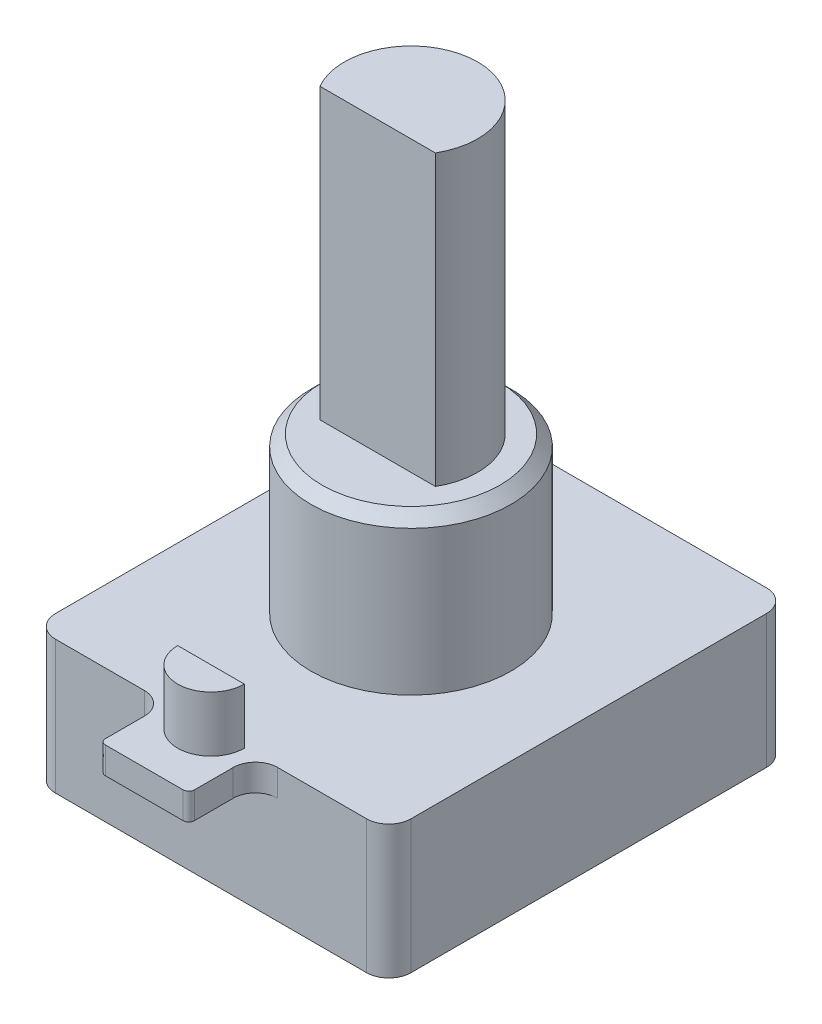
ISO-10303-21;
HEADER;
FILE_DESCRIPTION(('STEP AP214'),'2;1');
FILE_NAME('part.step','',(''),(''),'','','');
FILE_SCHEMA(('AUTOMOTIVE_DESIGN { 1 0 10303 214 1 1 1 1 }'));
ENDSEC;
DATA;
#1=APPLICATION_CONTEXT('core data for automotive mechanical design processes');
#2=APPLICATION_PROTOCOL_DEFINITION('international standard','automotive_design',2000,#1);
#3=PRODUCT_CONTEXT('',#1,'mechanical');
#4=PRODUCT('Part','Part','',(#3));
#5=PRODUCT_RELATED_PRODUCT_CATEGORY('part','',(#4));
#6=PRODUCT_DEFINITION_FORMATION('','',#4);
#7=PRODUCT_DEFINITION_CONTEXT('part definition',#1,'design');
#8=PRODUCT_DEFINITION('design','',#6,#7);
#9=PRODUCT_DEFINITION_SHAPE('','',#8);
#10=(LENGTH_UNIT() NAMED_UNIT(*) SI_UNIT(.MILLI.,.METRE.));
#11=(NAMED_UNIT(*) PLANE_ANGLE_UNIT() SI_UNIT($,.RADIAN.));
#12=(NAMED_UNIT(*) SI_UNIT($,.STERADIAN.) SOLID_ANGLE_UNIT());
#13=UNCERTAINTY_MEASURE_WITH_UNIT(LENGTH_MEASURE(1.E-05),#10,'distance_accuracy_value','');
#14=(GEOMETRIC_REPRESENTATION_CONTEXT(3) GLOBAL_UNCERTAINTY_ASSIGNED_CONTEXT((#13)) GLOBAL_UNIT_ASSIGNED_CONTEXT((#10,
#11,#12)) REPRESENTATION_CONTEXT('',''));
#15=CARTESIAN_POINT('',(0.,0.,0.));
#16=DIRECTION('',(0.,0.,1.));
#17=DIRECTION('',(1.,0.,0.));
#18=AXIS2_PLACEMENT_3D('',#15,#16,#17);
#19=CARTESIAN_POINT('',(0.,6.,0.));
#20=DIRECTION('',(0.,-1.,0.));
#21=DIRECTION('',(0.,0.,-1.));
#22=AXIS2_PLACEMENT_3D('',#19,#20,#21);
#23=PLANE('',#22);
#24=DIRECTION('',(-1.,0.,0.));
#25=VECTOR('',#24,1.);
#26=CARTESIAN_POINT('',(-2.,6.,12.));
#27=LINE('',#26,#25);
#28=CARTESIAN_POINT('',(1.75,6.,12.));
#29=VERTEX_POINT('',#28);
#30=CARTESIAN_POINT('',(-1.75,6.,12.));
#31=VERTEX_POINT('',#30);
#32=EDGE_CURVE('E214',#29,#31,#27,.T.);
#33=ORIENTED_EDGE('',*,*,#32,.F.);
#34=CARTESIAN_POINT('',(1.75,6.,11.75));
#35=DIRECTION('',(0.,-1.,0.));
#36=DIRECTION('',(0.,0.,-1.));
#37=AXIS2_PLACEMENT_3D('',#34,#35,#36);
#38=CIRCLE('',#37,0.25);
#39=CARTESIAN_POINT('',(2.,6.,11.75));
#40=VERTEX_POINT('',#39);
#41=EDGE_CURVE('E321',#29,#40,#38,.F.);
#42=ORIENTED_EDGE('',*,*,#41,.T.);
#43=DIRECTION('',(0.,0.,-1.));
#44=VECTOR('',#43,1.);
#45=CARTESIAN_POINT('',(2.,6.,12.));
#46=LINE('',#45,#44);
#47=CARTESIAN_POINT('',(2.,6.,10.));
#48=VERTEX_POINT('',#47);
#49=EDGE_CURVE('E227',#40,#48,#46,.T.);
#50=ORIENTED_EDGE('',*,*,#49,.T.);
#51=CARTESIAN_POINT('',(3.,6.,10.));
#52=DIRECTION('',(0.,-1.,0.));
#53=DIRECTION('',(0.,0.,-1.));
#54=AXIS2_PLACEMENT_3D('',#51,#52,#53);
#55=CIRCLE('',#54,1.);
#56=CARTESIAN_POINT('',(3.,6.,9.));
#57=VERTEX_POINT('',#56);
#58=EDGE_CURVE('E308',#48,#57,#55,.T.);
#59=ORIENTED_EDGE('',*,*,#58,.T.);
#60=DIRECTION('',(1.,0.,0.));
#61=VECTOR('',#60,1.);
#62=CARTESIAN_POINT('',(-8.,6.,9.));
#63=LINE('',#62,#61);
#64=CARTESIAN_POINT('',(7.,6.,9.));
#65=VERTEX_POINT('',#64);
#66=EDGE_CURVE('E240',#57,#65,#63,.T.);
#67=ORIENTED_EDGE('',*,*,#66,.T.);
#68=CARTESIAN_POINT('',(7.,6.,8.));
#69=DIRECTION('',(0.,-1.,0.));
#70=DIRECTION('',(0.,0.,-1.));
#71=AXIS2_PLACEMENT_3D('',#68,#69,#70);
#72=CIRCLE('',#71,1.);
#73=CARTESIAN_POINT('',(8.,6.,8.));
#74=VERTEX_POINT('',#73);
#75=EDGE_CURVE('E272',#65,#74,#72,.F.);
#76=ORIENTED_EDGE('',*,*,#75,.T.);
#77=DIRECTION('',(0.,0.,-1.));
#78=VECTOR('',#77,1.);
#79=CARTESIAN_POINT('',(8.,6.,9.));
#80=LINE('',#79,#78);
#81=CARTESIAN_POINT('',(8.,6.,-8.));
#82=VERTEX_POINT('',#81);
#83=EDGE_CURVE('E230',#74,#82,#80,.T.);
#84=ORIENTED_EDGE('',*,*,#83,.T.);
#85=CARTESIAN_POINT('',(7.,6.,-8.));
#86=DIRECTION('',(0.,-1.,0.));
#87=DIRECTION('',(0.,0.,-1.));
#88=AXIS2_PLACEMENT_3D('',#85,#86,#87);
#89=CIRCLE('',#88,1.);
#90=CARTESIAN_POINT('',(7.,6.,-9.));
#91=VERTEX_POINT('',#90);
#92=EDGE_CURVE('E278',#82,#91,#89,.F.);
#93=ORIENTED_EDGE('',*,*,#92,.T.);
#94=DIRECTION('',(-1.,0.,0.));
#95=VECTOR('',#94,1.);
#96=CARTESIAN_POINT('',(-8.,6.,-9.));
#97=LINE('',#96,#95);
#98=CARTESIAN_POINT('',(-7.,6.,-9.));
#99=VERTEX_POINT('',#98);
#100=EDGE_CURVE('E233',#91,#99,#97,.T.);
#101=ORIENTED_EDGE('',*,*,#100,.T.);
#102=CARTESIAN_POINT('',(-7.,6.,-8.));
#103=DIRECTION('',(0.,-1.,0.));
#104=DIRECTION('',(0.,0.,-1.));
#105=AXIS2_PLACEMENT_3D('',#102,#103,#104);
#106=CIRCLE('',#105,1.);
#107=CARTESIAN_POINT('',(-8.,6.,-8.));
#108=VERTEX_POINT('',#107);
#109=EDGE_CURVE('E276',#99,#108,#106,.F.);
#110=ORIENTED_EDGE('',*,*,#109,.T.);
#111=DIRECTION('',(0.,0.,1.));
#112=VECTOR('',#111,1.);
#113=CARTESIAN_POINT('',(-8.,6.,9.));
#114=LINE('',#113,#112);
#115=CARTESIAN_POINT('',(-8.,6.,8.));
#116=VERTEX_POINT('',#115);
#117=EDGE_CURVE('E237',#108,#116,#114,.T.);
#118=ORIENTED_EDGE('',*,*,#117,.T.);
#119=CARTESIAN_POINT('',(-7.,6.,8.));
#120=DIRECTION('',(0.,-1.,0.));
#121=DIRECTION('',(0.,0.,-1.));
#122=AXIS2_PLACEMENT_3D('',#119,#120,#121);
#123=CIRCLE('',#122,1.);
#124=CARTESIAN_POINT('',(-7.,6.,9.));
#125=VERTEX_POINT('',#124);
#126=EDGE_CURVE('E274',#116,#125,#123,.F.);
#127=ORIENTED_EDGE('',*,*,#126,.T.);
#128=CARTESIAN_POINT('',(-3.,6.,9.));
#129=VERTEX_POINT('',#128);
#130=EDGE_CURVE('E241',#125,#129,#63,.T.);
#131=ORIENTED_EDGE('',*,*,#130,.T.);
#132=CARTESIAN_POINT('',(-3.,6.,10.));
#133=DIRECTION('',(0.,-1.,0.));
#134=DIRECTION('',(0.,0.,-1.));
#135=AXIS2_PLACEMENT_3D('',#132,#133,#134);
#136=CIRCLE('',#135,1.);
#137=CARTESIAN_POINT('',(-2.,6.,10.));
#138=VERTEX_POINT('',#137);
#139=EDGE_CURVE('E305',#129,#138,#136,.T.);
#140=ORIENTED_EDGE('',*,*,#139,.T.);
#141=DIRECTION('',(0.,0.,-1.));
#142=VECTOR('',#141,1.);
#143=CARTESIAN_POINT('',(-2.,6.,12.));
#144=LINE('',#143,#142);
#145=CARTESIAN_POINT('',(-2.,6.,11.75));
#146=VERTEX_POINT('',#145);
#147=EDGE_CURVE('E225',#146,#138,#144,.T.);
#148=ORIENTED_EDGE('',*,*,#147,.F.);
#149=CARTESIAN_POINT('',(-1.75,6.,11.75));
#150=DIRECTION('',(0.,-1.,0.));
#151=DIRECTION('',(0.,0.,-1.));
#152=AXIS2_PLACEMENT_3D('',#149,#150,#151);
#153=CIRCLE('',#152,0.25);
#154=EDGE_CURVE('E319',#146,#31,#153,.F.);
#155=ORIENTED_EDGE('',*,*,#154,.T.);
#156=EDGE_LOOP('',(#33,#42,#50,#59,#67,#76,#84,#93,#101,#110,#118,#127,#131,#140,#148,#155));
#157=FACE_BOUND('',#156,.T.);
#158=CARTESIAN_POINT('',(0.,6.,0.));
#159=DIRECTION('',(0.,1.,0.));
#160=DIRECTION('',(0.,0.,1.));
#161=AXIS2_PLACEMENT_3D('',#158,#159,#160);
#162=CIRCLE('',#161,4.5);
#163=CARTESIAN_POINT('',(0.,6.,4.5));
#164=VERTEX_POINT('',#163);
#165=EDGE_CURVE('E210',#164,#164,#162,.T.);
#166=ORIENTED_EDGE('',*,*,#165,.F.);
#167=EDGE_LOOP('',(#166));
#168=FACE_BOUND('',#167,.T.);
#169=CARTESIAN_POINT('',(0.,6.,9.));
#170=DIRECTION('',(0.,1.,0.));
#171=DIRECTION('',(0.,0.,1.));
#172=AXIS2_PLACEMENT_3D('',#169,#170,#171);
#173=CIRCLE('',#172,1.5);
#174=CARTESIAN_POINT('',(-1.5,6.,9.));
#175=VERTEX_POINT('',#174);
#176=CARTESIAN_POINT('',(1.5,6.,9.));
#177=VERTEX_POINT('',#176);
#178=EDGE_CURVE('E53',#175,#177,#173,.T.);
#179=ORIENTED_EDGE('',*,*,#178,.F.);
#180=DIRECTION('',(1.,0.,0.));
#181=VECTOR('',#180,1.);
#182=CARTESIAN_POINT('',(-1.5,6.,9.));
#183=LINE('',#182,#181);
#184=EDGE_CURVE('E180',#175,#177,#183,.T.);
#185=ORIENTED_EDGE('',*,*,#184,.T.);
#186=EDGE_LOOP('',(#179,#185));
#187=FACE_BOUND('',#186,.T.);
#188=ADVANCED_FACE('F37',(#157,#168,#187),#23,.F.);
#189=CARTESIAN_POINT('',(-8.,6.,9.));
#190=DIRECTION('',(0.,0.,-1.));
#191=DIRECTION('',(-1.,0.,0.));
#192=AXIS2_PLACEMENT_3D('',#189,#190,#191);
#193=PLANE('',#192);
#194=DIRECTION('',(1.,0.,0.));
#195=VECTOR('',#194,1.);
#196=CARTESIAN_POINT('',(-2.,4.8,9.));
#197=LINE('',#196,#195);
#198=CARTESIAN_POINT('',(-3.,4.8,9.));
#199=VERTEX_POINT('',#198);
#200=CARTESIAN_POINT('',(3.,4.8,9.));
#201=VERTEX_POINT('',#200);
#202=EDGE_CURVE('E209',#199,#201,#197,.T.);
#203=ORIENTED_EDGE('',*,*,#202,.F.);
#204=DIRECTION('',(0.,-1.,0.));
#205=VECTOR('',#204,1.);
#206=CARTESIAN_POINT('',(-3.,6.,9.));
#207=LINE('',#206,#205);
#208=EDGE_CURVE('E297',#199,#129,#207,.F.);
#209=ORIENTED_EDGE('',*,*,#208,.T.);
#210=ORIENTED_EDGE('',*,*,#130,.F.);
#211=DIRECTION('',(0.,-1.,0.));
#212=VECTOR('',#211,1.);
#213=CARTESIAN_POINT('',(-7.,6.,9.));
#214=LINE('',#213,#212);
#215=CARTESIAN_POINT('',(-7.,0.,9.));
#216=VERTEX_POINT('',#215);
#217=EDGE_CURVE('E288',#125,#216,#214,.T.);
#218=ORIENTED_EDGE('',*,*,#217,.T.);
#219=DIRECTION('',(1.,0.,0.));
#220=VECTOR('',#219,1.);
#221=CARTESIAN_POINT('',(-8.,0.,9.));
#222=LINE('',#221,#220);
#223=CARTESIAN_POINT('',(7.,0.,9.));
#224=VERTEX_POINT('',#223);
#225=EDGE_CURVE('E234',#216,#224,#222,.T.);
#226=ORIENTED_EDGE('',*,*,#225,.T.);
#227=DIRECTION('',(0.,-1.,0.));
#228=VECTOR('',#227,1.);
#229=CARTESIAN_POINT('',(7.,6.,9.));
#230=LINE('',#229,#228);
#231=EDGE_CURVE('E285',#224,#65,#230,.F.);
#232=ORIENTED_EDGE('',*,*,#231,.T.);
#233=ORIENTED_EDGE('',*,*,#66,.F.);
#234=DIRECTION('',(0.,1.,0.));
#235=VECTOR('',#234,1.);
#236=CARTESIAN_POINT('',(3.,4.8,9.));
#237=LINE('',#236,#235);
#238=EDGE_CURVE('E294',#57,#201,#237,.F.);
#239=ORIENTED_EDGE('',*,*,#238,.T.);
#240=EDGE_LOOP('',(#203,#209,#210,#218,#226,#232,#233,#239));
#241=FACE_BOUND('',#240,.T.);
#242=ADVANCED_FACE('F348',(#241),#193,.F.);
#243=CARTESIAN_POINT('',(8.,6.,9.));
#244=DIRECTION('',(-1.,0.,0.));
#245=DIRECTION('',(0.,0.,1.));
#246=AXIS2_PLACEMENT_3D('',#243,#244,#245);
#247=PLANE('',#246);
#248=DIRECTION('',(0.,0.,-1.));
#249=VECTOR('',#248,1.);
#250=CARTESIAN_POINT('',(8.,0.,9.));
#251=LINE('',#250,#249);
#252=CARTESIAN_POINT('',(8.,0.,8.));
#253=VERTEX_POINT('',#252);
#254=CARTESIAN_POINT('',(8.,0.,-8.));
#255=VERTEX_POINT('',#254);
#256=EDGE_CURVE('E229',#253,#255,#251,.T.);
#257=ORIENTED_EDGE('',*,*,#256,.T.);
#258=DIRECTION('',(0.,-1.,0.));
#259=VECTOR('',#258,1.);
#260=CARTESIAN_POINT('',(8.,6.,-8.));
#261=LINE('',#260,#259);
#262=EDGE_CURVE('E270',#255,#82,#261,.F.);
#263=ORIENTED_EDGE('',*,*,#262,.T.);
#264=ORIENTED_EDGE('',*,*,#83,.F.);
#265=DIRECTION('',(0.,-1.,0.));
#266=VECTOR('',#265,1.);
#267=CARTESIAN_POINT('',(8.,6.,8.));
#268=LINE('',#267,#266);
#269=EDGE_CURVE('E267',#74,#253,#268,.T.);
#270=ORIENTED_EDGE('',*,*,#269,.T.);
#271=EDGE_LOOP('',(#257,#263,#264,#270));
#272=FACE_BOUND('',#271,.T.);
#273=ADVANCED_FACE('F354',(#272),#247,.F.);
#274=CARTESIAN_POINT('',(-8.,6.,-9.));
#275=DIRECTION('',(0.,0.,1.));
#276=DIRECTION('',(1.,0.,0.));
#277=AXIS2_PLACEMENT_3D('',#274,#275,#276);
#278=PLANE('',#277);
#279=ORIENTED_EDGE('',*,*,#100,.F.);
#280=DIRECTION('',(0.,-1.,0.));
#281=VECTOR('',#280,1.);
#282=CARTESIAN_POINT('',(7.,6.,-9.));
#283=LINE('',#282,#281);
#284=CARTESIAN_POINT('',(7.,0.,-9.));
#285=VERTEX_POINT('',#284);
#286=EDGE_CURVE('E256',#91,#285,#283,.T.);
#287=ORIENTED_EDGE('',*,*,#286,.T.);
#288=DIRECTION('',(-1.,0.,0.));
#289=VECTOR('',#288,1.);
#290=CARTESIAN_POINT('',(-8.,0.,-9.));
#291=LINE('',#290,#289);
#292=CARTESIAN_POINT('',(-7.,0.,-9.));
#293=VERTEX_POINT('',#292);
#294=EDGE_CURVE('E247',#285,#293,#291,.T.);
#295=ORIENTED_EDGE('',*,*,#294,.T.);
#296=DIRECTION('',(0.,-1.,0.));
#297=VECTOR('',#296,1.);
#298=CARTESIAN_POINT('',(-7.,6.,-9.));
#299=LINE('',#298,#297);
#300=EDGE_CURVE('E244',#293,#99,#299,.F.);
#301=ORIENTED_EDGE('',*,*,#300,.T.);
#302=EDGE_LOOP('',(#279,#287,#295,#301));
#303=FACE_BOUND('',#302,.T.);
#304=ADVANCED_FACE('F371',(#303),#278,.F.);
#305=CARTESIAN_POINT('',(-8.,6.,9.));
#306=DIRECTION('',(1.,0.,0.));
#307=DIRECTION('',(0.,0.,-1.));
#308=AXIS2_PLACEMENT_3D('',#305,#306,#307);
#309=PLANE('',#308);
#310=ORIENTED_EDGE('',*,*,#117,.F.);
#311=DIRECTION('',(0.,-1.,0.));
#312=VECTOR('',#311,1.);
#313=CARTESIAN_POINT('',(-8.,6.,-8.));
#314=LINE('',#313,#312);
#315=CARTESIAN_POINT('',(-8.,0.,-8.));
#316=VERTEX_POINT('',#315);
#317=EDGE_CURVE('E282',#108,#316,#314,.T.);
#318=ORIENTED_EDGE('',*,*,#317,.T.);
#319=DIRECTION('',(0.,0.,1.));
#320=VECTOR('',#319,1.);
#321=CARTESIAN_POINT('',(-8.,0.,9.));
#322=LINE('',#321,#320);
#323=CARTESIAN_POINT('',(-8.,0.,8.));
#324=VERTEX_POINT('',#323);
#325=EDGE_CURVE('E250',#316,#324,#322,.T.);
#326=ORIENTED_EDGE('',*,*,#325,.T.);
#327=DIRECTION('',(0.,-1.,0.));
#328=VECTOR('',#327,1.);
#329=CARTESIAN_POINT('',(-8.,6.,8.));
#330=LINE('',#329,#328);
#331=EDGE_CURVE('E280',#324,#116,#330,.F.);
#332=ORIENTED_EDGE('',*,*,#331,.T.);
#333=EDGE_LOOP('',(#310,#318,#326,#332));
#334=FACE_BOUND('',#333,.T.);
#335=ADVANCED_FACE('F366',(#334),#309,.F.);
#336=CARTESIAN_POINT('',(0.,0.,0.));
#337=DIRECTION('',(0.,-1.,0.));
#338=DIRECTION('',(0.,0.,-1.));
#339=AXIS2_PLACEMENT_3D('',#336,#337,#338);
#340=PLANE('',#339);
#341=ORIENTED_EDGE('',*,*,#294,.F.);
#342=CARTESIAN_POINT('',(7.,0.,-8.));
#343=DIRECTION('',(0.,-1.,0.));
#344=DIRECTION('',(0.,0.,-1.));
#345=AXIS2_PLACEMENT_3D('',#342,#343,#344);
#346=CIRCLE('',#345,1.);
#347=EDGE_CURVE('E265',#285,#255,#346,.T.);
#348=ORIENTED_EDGE('',*,*,#347,.T.);
#349=ORIENTED_EDGE('',*,*,#256,.F.);
#350=CARTESIAN_POINT('',(7.,0.,8.));
#351=DIRECTION('',(0.,-1.,0.));
#352=DIRECTION('',(0.,0.,-1.));
#353=AXIS2_PLACEMENT_3D('',#350,#351,#352);
#354=CIRCLE('',#353,1.);
#355=EDGE_CURVE('E259',#253,#224,#354,.T.);
#356=ORIENTED_EDGE('',*,*,#355,.T.);
#357=ORIENTED_EDGE('',*,*,#225,.F.);
#358=CARTESIAN_POINT('',(-7.,0.,8.));
#359=DIRECTION('',(0.,-1.,0.));
#360=DIRECTION('',(0.,0.,-1.));
#361=AXIS2_PLACEMENT_3D('',#358,#359,#360);
#362=CIRCLE('',#361,1.);
#363=EDGE_CURVE('E261',#216,#324,#362,.T.);
#364=ORIENTED_EDGE('',*,*,#363,.T.);
#365=ORIENTED_EDGE('',*,*,#325,.F.);
#366=CARTESIAN_POINT('',(-7.,0.,-8.));
#367=DIRECTION('',(0.,-1.,0.));
#368=DIRECTION('',(0.,0.,-1.));
#369=AXIS2_PLACEMENT_3D('',#366,#367,#368);
#370=CIRCLE('',#369,1.);
#371=EDGE_CURVE('E263',#316,#293,#370,.T.);
#372=ORIENTED_EDGE('',*,*,#371,.T.);
#373=EDGE_LOOP('',(#341,#348,#349,#356,#357,#364,#365,#372));
#374=FACE_BOUND('',#373,.T.);
#375=ADVANCED_FACE('F363',(#374),#340,.T.);
#376=CARTESIAN_POINT('',(7.,6.,-8.));
#377=DIRECTION('',(0.,-1.,0.));
#378=DIRECTION('',(0.,0.,-1.));
#379=AXIS2_PLACEMENT_3D('',#376,#377,#378);
#380=CYLINDRICAL_SURFACE('',#379,1.);
#381=ORIENTED_EDGE('',*,*,#92,.F.);
#382=ORIENTED_EDGE('',*,*,#262,.F.);
#383=ORIENTED_EDGE('',*,*,#347,.F.);
#384=ORIENTED_EDGE('',*,*,#286,.F.);
#385=EDGE_LOOP('',(#381,#382,#383,#384));
#386=FACE_BOUND('',#385,.T.);
#387=ADVANCED_FACE('F365',(#386),#380,.T.);
#388=CARTESIAN_POINT('',(-7.,6.,-8.));
#389=DIRECTION('',(0.,-1.,0.));
#390=DIRECTION('',(0.,0.,-1.));
#391=AXIS2_PLACEMENT_3D('',#388,#389,#390);
#392=CYLINDRICAL_SURFACE('',#391,1.);
#393=ORIENTED_EDGE('',*,*,#109,.F.);
#394=ORIENTED_EDGE('',*,*,#300,.F.);
#395=ORIENTED_EDGE('',*,*,#371,.F.);
#396=ORIENTED_EDGE('',*,*,#317,.F.);
#397=EDGE_LOOP('',(#393,#394,#395,#396));
#398=FACE_BOUND('',#397,.T.);
#399=ADVANCED_FACE('F381',(#398),#392,.T.);
#400=CARTESIAN_POINT('',(-7.,6.,8.));
#401=DIRECTION('',(0.,-1.,0.));
#402=DIRECTION('',(0.,0.,-1.));
#403=AXIS2_PLACEMENT_3D('',#400,#401,#402);
#404=CYLINDRICAL_SURFACE('',#403,1.);
#405=ORIENTED_EDGE('',*,*,#126,.F.);
#406=ORIENTED_EDGE('',*,*,#331,.F.);
#407=ORIENTED_EDGE('',*,*,#363,.F.);
#408=ORIENTED_EDGE('',*,*,#217,.F.);
#409=EDGE_LOOP('',(#405,#406,#407,#408));
#410=FACE_BOUND('',#409,.T.);
#411=ADVANCED_FACE('F385',(#410),#404,.T.);
#412=CARTESIAN_POINT('',(7.,6.,8.));
#413=DIRECTION('',(0.,-1.,0.));
#414=DIRECTION('',(0.,0.,-1.));
#415=AXIS2_PLACEMENT_3D('',#412,#413,#414);
#416=CYLINDRICAL_SURFACE('',#415,1.);
#417=ORIENTED_EDGE('',*,*,#75,.F.);
#418=ORIENTED_EDGE('',*,*,#231,.F.);
#419=ORIENTED_EDGE('',*,*,#355,.F.);
#420=ORIENTED_EDGE('',*,*,#269,.F.);
#421=EDGE_LOOP('',(#417,#418,#419,#420));
#422=FACE_BOUND('',#421,.T.);
#423=ADVANCED_FACE('F389',(#422),#416,.T.);
#424=CARTESIAN_POINT('',(2.,4.8,12.));
#425=DIRECTION('',(-1.,0.,0.));
#426=DIRECTION('',(0.,-1.,0.));
#427=AXIS2_PLACEMENT_3D('',#424,#425,#426);
#428=PLANE('',#427);
#429=ORIENTED_EDGE('',*,*,#49,.F.);
#430=DIRECTION('',(0.,1.,0.));
#431=VECTOR('',#430,1.);
#432=CARTESIAN_POINT('',(2.,4.8,11.75));
#433=LINE('',#432,#431);
#434=CARTESIAN_POINT('',(2.,4.8,11.75));
#435=VERTEX_POINT('',#434);
#436=EDGE_CURVE('E323',#40,#435,#433,.F.);
#437=ORIENTED_EDGE('',*,*,#436,.T.);
#438=DIRECTION('',(0.,0.,-1.));
#439=VECTOR('',#438,1.);
#440=CARTESIAN_POINT('',(2.,4.8,12.));
#441=LINE('',#440,#439);
#442=CARTESIAN_POINT('',(2.,4.8,10.));
#443=VERTEX_POINT('',#442);
#444=EDGE_CURVE('E220',#435,#443,#441,.T.);
#445=ORIENTED_EDGE('',*,*,#444,.T.);
#446=DIRECTION('',(0.,1.,0.));
#447=VECTOR('',#446,1.);
#448=CARTESIAN_POINT('',(2.,6.,10.));
#449=LINE('',#448,#447);
#450=EDGE_CURVE('E299',#443,#48,#449,.T.);
#451=ORIENTED_EDGE('',*,*,#450,.T.);
#452=EDGE_LOOP('',(#429,#437,#445,#451));
#453=FACE_BOUND('',#452,.T.);
#454=ADVANCED_FACE('F361',(#453),#428,.F.);
#455=CARTESIAN_POINT('',(-2.,4.8,12.));
#456=DIRECTION('',(1.,0.,0.));
#457=DIRECTION('',(0.,0.,-1.));
#458=AXIS2_PLACEMENT_3D('',#455,#456,#457);
#459=PLANE('',#458);
#460=DIRECTION('',(0.,0.,-1.));
#461=VECTOR('',#460,1.);
#462=CARTESIAN_POINT('',(-2.,4.8,12.));
#463=LINE('',#462,#461);
#464=CARTESIAN_POINT('',(-2.,4.8,11.75));
#465=VERTEX_POINT('',#464);
#466=CARTESIAN_POINT('',(-2.,4.8,10.));
#467=VERTEX_POINT('',#466);
#468=EDGE_CURVE('E223',#465,#467,#463,.T.);
#469=ORIENTED_EDGE('',*,*,#468,.F.);
#470=DIRECTION('',(0.,-1.,0.));
#471=VECTOR('',#470,1.);
#472=CARTESIAN_POINT('',(-2.,4.8,11.75));
#473=LINE('',#472,#471);
#474=EDGE_CURVE('E213',#465,#146,#473,.F.);
#475=ORIENTED_EDGE('',*,*,#474,.T.);
#476=ORIENTED_EDGE('',*,*,#147,.T.);
#477=DIRECTION('',(0.,-1.,0.));
#478=VECTOR('',#477,1.);
#479=CARTESIAN_POINT('',(-2.,4.8,10.));
#480=LINE('',#479,#478);
#481=EDGE_CURVE('E291',#138,#467,#480,.T.);
#482=ORIENTED_EDGE('',*,*,#481,.T.);
#483=EDGE_LOOP('',(#469,#475,#476,#482));
#484=FACE_BOUND('',#483,.T.);
#485=ADVANCED_FACE('F457',(#484),#459,.F.);
#486=CARTESIAN_POINT('',(-2.,4.8,12.));
#487=DIRECTION('',(0.,1.,0.));
#488=DIRECTION('',(0.,0.,1.));
#489=AXIS2_PLACEMENT_3D('',#486,#487,#488);
#490=PLANE('',#489);
#491=ORIENTED_EDGE('',*,*,#444,.F.);
#492=CARTESIAN_POINT('',(1.75,4.8,11.75));
#493=DIRECTION('',(0.,1.,0.));
#494=DIRECTION('',(0.,0.,1.));
#495=AXIS2_PLACEMENT_3D('',#492,#493,#494);
#496=CIRCLE('',#495,0.25);
#497=CARTESIAN_POINT('',(1.75,4.8,12.));
#498=VERTEX_POINT('',#497);
#499=EDGE_CURVE('E327',#435,#498,#496,.F.);
#500=ORIENTED_EDGE('',*,*,#499,.T.);
#501=DIRECTION('',(1.,0.,0.));
#502=VECTOR('',#501,1.);
#503=CARTESIAN_POINT('',(-2.,4.8,12.));
#504=LINE('',#503,#502);
#505=CARTESIAN_POINT('',(-1.75,4.8,12.));
#506=VERTEX_POINT('',#505);
#507=EDGE_CURVE('E217',#506,#498,#504,.T.);
#508=ORIENTED_EDGE('',*,*,#507,.F.);
#509=CARTESIAN_POINT('',(-1.75,4.8,11.75));
#510=DIRECTION('',(0.,1.,0.));
#511=DIRECTION('',(0.,0.,1.));
#512=AXIS2_PLACEMENT_3D('',#509,#510,#511);
#513=CIRCLE('',#512,0.25);
#514=EDGE_CURVE('E325',#506,#465,#513,.F.);
#515=ORIENTED_EDGE('',*,*,#514,.T.);
#516=ORIENTED_EDGE('',*,*,#468,.T.);
#517=CARTESIAN_POINT('',(-3.,4.8,10.));
#518=DIRECTION('',(0.,1.,0.));
#519=DIRECTION('',(0.,0.,1.));
#520=AXIS2_PLACEMENT_3D('',#517,#518,#519);
#521=CIRCLE('',#520,1.);
#522=EDGE_CURVE('E302',#467,#199,#521,.T.);
#523=ORIENTED_EDGE('',*,*,#522,.T.);
#524=ORIENTED_EDGE('',*,*,#202,.T.);
#525=CARTESIAN_POINT('',(3.,4.8,10.));
#526=DIRECTION('',(0.,1.,0.));
#527=DIRECTION('',(0.,0.,1.));
#528=AXIS2_PLACEMENT_3D('',#525,#526,#527);
#529=CIRCLE('',#528,1.);
#530=EDGE_CURVE('E310',#201,#443,#529,.T.);
#531=ORIENTED_EDGE('',*,*,#530,.T.);
#532=EDGE_LOOP('',(#491,#500,#508,#515,#516,#523,#524,#531));
#533=FACE_BOUND('',#532,.T.);
#534=ADVANCED_FACE('F459',(#533),#490,.F.);
#535=CARTESIAN_POINT('',(0.,0.,12.));
#536=DIRECTION('',(0.,0.,-1.));
#537=DIRECTION('',(-1.,0.,0.));
#538=AXIS2_PLACEMENT_3D('',#535,#536,#537);
#539=PLANE('',#538);
#540=ORIENTED_EDGE('',*,*,#507,.T.);
#541=DIRECTION('',(0.,1.,0.));
#542=VECTOR('',#541,1.);
#543=CARTESIAN_POINT('',(1.75,0.,12.));
#544=LINE('',#543,#542);
#545=EDGE_CURVE('E316',#498,#29,#544,.T.);
#546=ORIENTED_EDGE('',*,*,#545,.T.);
#547=ORIENTED_EDGE('',*,*,#32,.T.);
#548=DIRECTION('',(0.,-1.,0.));
#549=VECTOR('',#548,1.);
#550=CARTESIAN_POINT('',(-1.75,0.,12.));
#551=LINE('',#550,#549);
#552=EDGE_CURVE('E313',#31,#506,#551,.T.);
#553=ORIENTED_EDGE('',*,*,#552,.T.);
#554=EDGE_LOOP('',(#540,#546,#547,#553));
#555=FACE_BOUND('',#554,.T.);
#556=ADVANCED_FACE('F398',(#555),#539,.F.);
#557=CARTESIAN_POINT('',(-3.,4.8,10.));
#558=DIRECTION('',(0.,1.,0.));
#559=DIRECTION('',(0.,0.,1.));
#560=AXIS2_PLACEMENT_3D('',#557,#558,#559);
#561=CYLINDRICAL_SURFACE('',#560,1.);
#562=ORIENTED_EDGE('',*,*,#139,.F.);
#563=ORIENTED_EDGE('',*,*,#208,.F.);
#564=ORIENTED_EDGE('',*,*,#522,.F.);
#565=ORIENTED_EDGE('',*,*,#481,.F.);
#566=EDGE_LOOP('',(#562,#563,#564,#565));
#567=FACE_BOUND('',#566,.T.);
#568=ADVANCED_FACE('F394',(#567),#561,.F.);
#569=CARTESIAN_POINT('',(3.,4.8,10.));
#570=DIRECTION('',(0.,-1.,0.));
#571=DIRECTION('',(1.,0.,0.));
#572=AXIS2_PLACEMENT_3D('',#569,#570,#571);
#573=CYLINDRICAL_SURFACE('',#572,1.);
#574=ORIENTED_EDGE('',*,*,#530,.F.);
#575=ORIENTED_EDGE('',*,*,#238,.F.);
#576=ORIENTED_EDGE('',*,*,#58,.F.);
#577=ORIENTED_EDGE('',*,*,#450,.F.);
#578=EDGE_LOOP('',(#574,#575,#576,#577));
#579=FACE_BOUND('',#578,.T.);
#580=ADVANCED_FACE('F397',(#579),#573,.F.);
#581=CARTESIAN_POINT('',(1.75,0.,11.75));
#582=DIRECTION('',(0.,1.,0.));
#583=DIRECTION('',(-1.,0.,0.));
#584=AXIS2_PLACEMENT_3D('',#581,#582,#583);
#585=CYLINDRICAL_SURFACE('',#584,0.25);
#586=ORIENTED_EDGE('',*,*,#499,.F.);
#587=ORIENTED_EDGE('',*,*,#436,.F.);
#588=ORIENTED_EDGE('',*,*,#41,.F.);
#589=ORIENTED_EDGE('',*,*,#545,.F.);
#590=EDGE_LOOP('',(#586,#587,#588,#589));
#591=FACE_BOUND('',#590,.T.);
#592=ADVANCED_FACE('F402',(#591),#585,.T.);
#593=CARTESIAN_POINT('',(-1.75,0.,11.75));
#594=DIRECTION('',(0.,-1.,0.));
#595=DIRECTION('',(0.,0.,-1.));
#596=AXIS2_PLACEMENT_3D('',#593,#594,#595);
#597=CYLINDRICAL_SURFACE('',#596,0.25);
#598=ORIENTED_EDGE('',*,*,#154,.F.);
#599=ORIENTED_EDGE('',*,*,#474,.F.);
#600=ORIENTED_EDGE('',*,*,#514,.F.);
#601=ORIENTED_EDGE('',*,*,#552,.F.);
#602=EDGE_LOOP('',(#598,#599,#600,#601));
#603=FACE_BOUND('',#602,.T.);
#604=ADVANCED_FACE('F405',(#603),#597,.T.);
#605=CARTESIAN_POINT('',(0.,13.,0.));
#606=DIRECTION('',(0.,-1.,0.));
#607=DIRECTION('',(0.,0.,-1.));
#608=AXIS2_PLACEMENT_3D('',#605,#606,#607);
#609=CYLINDRICAL_SURFACE('',#608,4.5);
#610=CARTESIAN_POINT('',(0.,12.5,0.));
#611=DIRECTION('',(0.,1.,0.));
#612=DIRECTION('',(0.,0.,1.));
#613=AXIS2_PLACEMENT_3D('',#610,#611,#612);
#614=CIRCLE('',#613,4.5);
#615=CARTESIAN_POINT('',(0.,12.5,4.5));
#616=VERTEX_POINT('',#615);
#617=EDGE_CURVE('E11',#616,#616,#614,.F.);
#618=ORIENTED_EDGE('',*,*,#617,.T.);
#619=EDGE_LOOP('',(#618));
#620=FACE_BOUND('',#619,.T.);
#621=ORIENTED_EDGE('',*,*,#165,.T.);
#622=EDGE_LOOP('',(#621));
#623=FACE_BOUND('',#622,.T.);
#624=ADVANCED_FACE('F344',(#620,#623),#609,.T.);
#625=CARTESIAN_POINT('',(0.,13.,0.));
#626=DIRECTION('',(0.,1.,0.));
#627=DIRECTION('',(0.,0.,1.));
#628=AXIS2_PLACEMENT_3D('',#625,#626,#627);
#629=PLANE('',#628);
#630=CARTESIAN_POINT('',(0.,13.,0.));
#631=DIRECTION('',(0.,1.,0.));
#632=DIRECTION('',(0.,0.,1.));
#633=AXIS2_PLACEMENT_3D('',#630,#631,#632);
#634=CIRCLE('',#633,3.);
#635=CARTESIAN_POINT('',(2.59807621135332,13.,1.5));
#636=VERTEX_POINT('',#635);
#637=CARTESIAN_POINT('',(-2.59807621135332,13.,1.5));
#638=VERTEX_POINT('',#637);
#639=EDGE_CURVE('E187',#636,#638,#634,.T.);
#640=ORIENTED_EDGE('',*,*,#639,.F.);
#641=DIRECTION('',(1.,0.,0.));
#642=VECTOR('',#641,1.);
#643=CARTESIAN_POINT('',(-2.59807621135332,13.,1.5));
#644=LINE('',#643,#642);
#645=EDGE_CURVE('E60',#638,#636,#644,.T.);
#646=ORIENTED_EDGE('',*,*,#645,.F.);
#647=EDGE_LOOP('',(#640,#646));
#648=FACE_BOUND('',#647,.T.);
#649=CARTESIAN_POINT('',(0.,13.,0.));
#650=DIRECTION('',(0.,1.,0.));
#651=DIRECTION('',(0.,0.,1.));
#652=AXIS2_PLACEMENT_3D('',#649,#650,#651);
#653=CIRCLE('',#652,4.);
#654=CARTESIAN_POINT('',(0.,13.,4.));
#655=VERTEX_POINT('',#654);
#656=EDGE_CURVE('E46',#655,#655,#653,.T.);
#657=ORIENTED_EDGE('',*,*,#656,.T.);
#658=EDGE_LOOP('',(#657));
#659=FACE_BOUND('',#658,.T.);
#660=ADVANCED_FACE('F332',(#648,#659),#629,.T.);
#661=CARTESIAN_POINT('',(0.,13.,0.));
#662=DIRECTION('',(0.,-1.,0.));
#663=DIRECTION('',(0.,0.,-1.));
#664=AXIS2_PLACEMENT_3D('',#661,#662,#663);
#665=CONICAL_SURFACE('',#664,4.,0.785398163397447);
#666=ORIENTED_EDGE('',*,*,#617,.F.);
#667=EDGE_LOOP('',(#666));
#668=FACE_BOUND('',#667,.T.);
#669=ORIENTED_EDGE('',*,*,#656,.F.);
#670=EDGE_LOOP('',(#669));
#671=FACE_BOUND('',#670,.T.);
#672=ADVANCED_FACE('F40',(#668,#671),#665,.T.);
#673=CARTESIAN_POINT('',(0.,26.,0.));
#674=DIRECTION('',(0.,-1.,0.));
#675=DIRECTION('',(0.,0.,-1.));
#676=AXIS2_PLACEMENT_3D('',#673,#674,#675);
#677=CYLINDRICAL_SURFACE('',#676,3.);
#678=ORIENTED_EDGE('',*,*,#639,.T.);
#679=DIRECTION('',(0.,-1.,0.));
#680=VECTOR('',#679,1.);
#681=CARTESIAN_POINT('',(-2.59807621135332,26.,1.5));
#682=LINE('',#681,#680);
#683=CARTESIAN_POINT('',(-2.59807621135332,26.,1.5));
#684=VERTEX_POINT('',#683);
#685=EDGE_CURVE('E207',#684,#638,#682,.T.);
#686=ORIENTED_EDGE('',*,*,#685,.F.);
#687=CARTESIAN_POINT('',(0.,26.,0.));
#688=DIRECTION('',(0.,1.,0.));
#689=DIRECTION('',(0.,0.,1.));
#690=AXIS2_PLACEMENT_3D('',#687,#688,#689);
#691=CIRCLE('',#690,3.);
#692=CARTESIAN_POINT('',(2.59807621135332,26.,1.5));
#693=VERTEX_POINT('',#692);
#694=EDGE_CURVE('E196',#693,#684,#691,.T.);
#695=ORIENTED_EDGE('',*,*,#694,.F.);
#696=DIRECTION('',(0.,-1.,0.));
#697=VECTOR('',#696,1.);
#698=CARTESIAN_POINT('',(2.59807621135332,26.,1.5));
#699=LINE('',#698,#697);
#700=EDGE_CURVE('E201',#693,#636,#699,.T.);
#701=ORIENTED_EDGE('',*,*,#700,.T.);
#702=EDGE_LOOP('',(#678,#686,#695,#701));
#703=FACE_BOUND('',#702,.T.);
#704=ADVANCED_FACE('F335',(#703),#677,.T.);
#705=CARTESIAN_POINT('',(-2.59807621135332,26.,1.5));
#706=DIRECTION('',(0.,0.,-1.));
#707=DIRECTION('',(-1.,0.,0.));
#708=AXIS2_PLACEMENT_3D('',#705,#706,#707);
#709=PLANE('',#708);
#710=ORIENTED_EDGE('',*,*,#645,.T.);
#711=ORIENTED_EDGE('',*,*,#700,.F.);
#712=DIRECTION('',(1.,0.,0.));
#713=VECTOR('',#712,1.);
#714=CARTESIAN_POINT('',(-2.59807621135332,26.,1.5));
#715=LINE('',#714,#713);
#716=EDGE_CURVE('E199',#684,#693,#715,.T.);
#717=ORIENTED_EDGE('',*,*,#716,.F.);
#718=ORIENTED_EDGE('',*,*,#685,.T.);
#719=EDGE_LOOP('',(#710,#711,#717,#718));
#720=FACE_BOUND('',#719,.T.);
#721=ADVANCED_FACE('F341',(#720),#709,.F.);
#722=CARTESIAN_POINT('',(0.,26.,0.));
#723=DIRECTION('',(0.,1.,0.));
#724=DIRECTION('',(0.,0.,1.));
#725=AXIS2_PLACEMENT_3D('',#722,#723,#724);
#726=PLANE('',#725);
#727=ORIENTED_EDGE('',*,*,#694,.T.);
#728=ORIENTED_EDGE('',*,*,#716,.T.);
#729=EDGE_LOOP('',(#727,#728));
#730=FACE_BOUND('',#729,.T.);
#731=ADVANCED_FACE('F470',(#730),#726,.T.);
#732=CARTESIAN_POINT('',(0.,8.5,9.));
#733=DIRECTION('',(0.,-1.,0.));
#734=DIRECTION('',(0.,0.,-1.));
#735=AXIS2_PLACEMENT_3D('',#732,#733,#734);
#736=CYLINDRICAL_SURFACE('',#735,1.5);
#737=ORIENTED_EDGE('',*,*,#178,.T.);
#738=DIRECTION('',(0.,-1.,0.));
#739=VECTOR('',#738,1.);
#740=CARTESIAN_POINT('',(1.5,8.5,9.));
#741=LINE('',#740,#739);
#742=CARTESIAN_POINT('',(1.5,8.5,9.));
#743=VERTEX_POINT('',#742);
#744=EDGE_CURVE('E182',#743,#177,#741,.T.);
#745=ORIENTED_EDGE('',*,*,#744,.F.);
#746=CARTESIAN_POINT('',(0.,8.5,9.));
#747=DIRECTION('',(0.,1.,0.));
#748=DIRECTION('',(0.,0.,1.));
#749=AXIS2_PLACEMENT_3D('',#746,#747,#748);
#750=CIRCLE('',#749,1.5);
#751=CARTESIAN_POINT('',(-1.5,8.5,9.));
#752=VERTEX_POINT('',#751);
#753=EDGE_CURVE('E176',#752,#743,#750,.T.);
#754=ORIENTED_EDGE('',*,*,#753,.F.);
#755=DIRECTION('',(0.,-1.,0.));
#756=VECTOR('',#755,1.);
#757=CARTESIAN_POINT('',(-1.5,8.5,9.));
#758=LINE('',#757,#756);
#759=EDGE_CURVE('E188',#752,#175,#758,.T.);
#760=ORIENTED_EDGE('',*,*,#759,.T.);
#761=EDGE_LOOP('',(#737,#745,#754,#760));
#762=FACE_BOUND('',#761,.T.);
#763=ADVANCED_FACE('F183',(#762),#736,.T.);
#764=CARTESIAN_POINT('',(-1.5,8.5,9.));
#765=DIRECTION('',(0.,0.,-1.));
#766=DIRECTION('',(-1.,0.,0.));
#767=AXIS2_PLACEMENT_3D('',#764,#765,#766);
#768=PLANE('',#767);
#769=ORIENTED_EDGE('',*,*,#184,.F.);
#770=ORIENTED_EDGE('',*,*,#759,.F.);
#771=DIRECTION('',(1.,0.,0.));
#772=VECTOR('',#771,1.);
#773=CARTESIAN_POINT('',(-1.5,8.5,9.));
#774=LINE('',#773,#772);
#775=EDGE_CURVE('E179',#752,#743,#774,.T.);
#776=ORIENTED_EDGE('',*,*,#775,.T.);
#777=ORIENTED_EDGE('',*,*,#744,.T.);
#778=EDGE_LOOP('',(#769,#770,#776,#777));
#779=FACE_BOUND('',#778,.T.);
#780=ADVANCED_FACE('F190',(#779),#768,.T.);
#781=CARTESIAN_POINT('',(0.,8.5,9.));
#782=DIRECTION('',(0.,1.,0.));
#783=DIRECTION('',(0.,0.,1.));
#784=AXIS2_PLACEMENT_3D('',#781,#782,#783);
#785=PLANE('',#784);
#786=ORIENTED_EDGE('',*,*,#753,.T.);
#787=ORIENTED_EDGE('',*,*,#775,.F.);
#788=EDGE_LOOP('',(#786,#787));
#789=FACE_BOUND('',#788,.T.);
#790=ADVANCED_FACE('F177',(#789),#785,.T.);
#791=CLOSED_SHELL('',(#188,#242,#273,#304,#335,#375,#387,#399,#411,#423,#454,#485,#534,#556,
#568,#580,#592,#604,#624,#660,#672,#704,#721,#731,#763,#780,#790));
#792=MANIFOLD_SOLID_BREP('B2',#791);
#793=ADVANCED_BREP_SHAPE_REPRESENTATION('',(#18,#792),#14);
#794=SHAPE_DEFINITION_REPRESENTATION(#9,#793);
ENDSEC;
END-ISO-10303-21;
